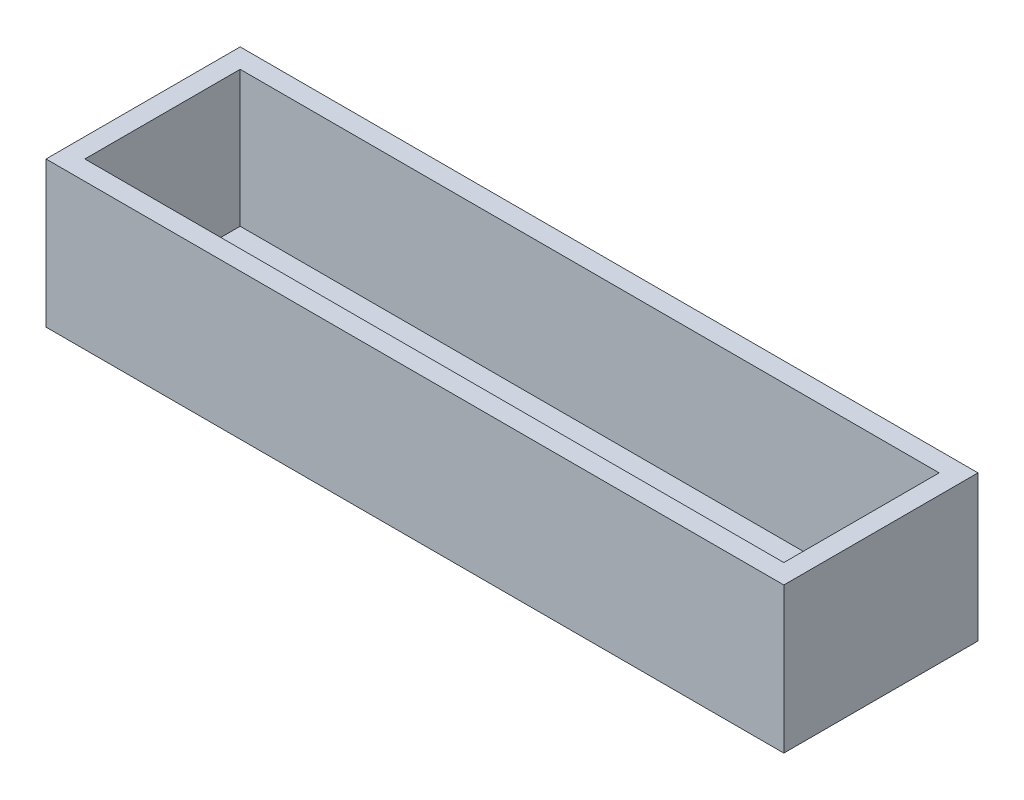
ISO-10303-21;
HEADER;
FILE_DESCRIPTION(('STEP AP214'),'2;1');
FILE_NAME('part.step','',(''),(''),'','','');
FILE_SCHEMA(('AUTOMOTIVE_DESIGN { 1 0 10303 214 1 1 1 1 }'));
ENDSEC;
DATA;
#1=APPLICATION_CONTEXT('core data for automotive mechanical design processes');
#2=APPLICATION_PROTOCOL_DEFINITION('international standard','automotive_design',2000,#1);
#3=PRODUCT_CONTEXT('',#1,'mechanical');
#4=PRODUCT('Part','Part','',(#3));
#5=PRODUCT_RELATED_PRODUCT_CATEGORY('part','',(#4));
#6=PRODUCT_DEFINITION_FORMATION('','',#4);
#7=PRODUCT_DEFINITION_CONTEXT('part definition',#1,'design');
#8=PRODUCT_DEFINITION('design','',#6,#7);
#9=PRODUCT_DEFINITION_SHAPE('','',#8);
#10=(LENGTH_UNIT() NAMED_UNIT(*) SI_UNIT(.MILLI.,.METRE.));
#11=(NAMED_UNIT(*) PLANE_ANGLE_UNIT() SI_UNIT($,.RADIAN.));
#12=(NAMED_UNIT(*) SI_UNIT($,.STERADIAN.) SOLID_ANGLE_UNIT());
#13=UNCERTAINTY_MEASURE_WITH_UNIT(LENGTH_MEASURE(1.E-05),#10,'distance_accuracy_value','');
#14=(GEOMETRIC_REPRESENTATION_CONTEXT(3) GLOBAL_UNCERTAINTY_ASSIGNED_CONTEXT((#13)) GLOBAL_UNIT_ASSIGNED_CONTEXT((#10,
#11,#12)) REPRESENTATION_CONTEXT('',''));
#15=CARTESIAN_POINT('',(0.,0.,0.));
#16=DIRECTION('',(0.,0.,1.));
#17=DIRECTION('',(1.,0.,0.));
#18=AXIS2_PLACEMENT_3D('',#15,#16,#17);
#19=CARTESIAN_POINT('',(38.,15.,-10.));
#20=DIRECTION('',(-1.,0.,0.));
#21=DIRECTION('',(0.,0.,1.));
#22=AXIS2_PLACEMENT_3D('',#19,#20,#21);
#23=PLANE('',#22);
#24=DIRECTION('',(0.,0.,-1.));
#25=VECTOR('',#24,1.);
#26=CARTESIAN_POINT('',(38.,0.,-10.));
#27=LINE('',#26,#25);
#28=CARTESIAN_POINT('',(38.,0.,10.));
#29=VERTEX_POINT('',#28);
#30=CARTESIAN_POINT('',(38.,0.,-10.));
#31=VERTEX_POINT('',#30);
#32=EDGE_CURVE('E158',#29,#31,#27,.T.);
#33=ORIENTED_EDGE('',*,*,#32,.T.);
#34=DIRECTION('',(0.,-1.,0.));
#35=VECTOR('',#34,1.);
#36=CARTESIAN_POINT('',(38.,15.,-10.));
#37=LINE('',#36,#35);
#38=CARTESIAN_POINT('',(38.,15.,-10.));
#39=VERTEX_POINT('',#38);
#40=EDGE_CURVE('E11',#39,#31,#37,.T.);
#41=ORIENTED_EDGE('',*,*,#40,.F.);
#42=DIRECTION('',(0.,0.,-1.));
#43=VECTOR('',#42,1.);
#44=CARTESIAN_POINT('',(38.,15.,-10.));
#45=LINE('',#44,#43);
#46=CARTESIAN_POINT('',(38.,15.,10.));
#47=VERTEX_POINT('',#46);
#48=EDGE_CURVE('E164',#47,#39,#45,.T.);
#49=ORIENTED_EDGE('',*,*,#48,.F.);
#50=DIRECTION('',(0.,-1.,0.));
#51=VECTOR('',#50,1.);
#52=CARTESIAN_POINT('',(38.,15.,10.));
#53=LINE('',#52,#51);
#54=EDGE_CURVE('E174',#47,#29,#53,.T.);
#55=ORIENTED_EDGE('',*,*,#54,.T.);
#56=EDGE_LOOP('',(#33,#41,#49,#55));
#57=FACE_BOUND('',#56,.T.);
#58=ADVANCED_FACE('F39',(#57),#23,.F.);
#59=CARTESIAN_POINT('',(-38.,15.,-10.));
#60=DIRECTION('',(0.,0.,1.));
#61=DIRECTION('',(1.,0.,0.));
#62=AXIS2_PLACEMENT_3D('',#59,#60,#61);
#63=PLANE('',#62);
#64=DIRECTION('',(-1.,0.,0.));
#65=VECTOR('',#64,1.);
#66=CARTESIAN_POINT('',(-38.,0.,-10.));
#67=LINE('',#66,#65);
#68=CARTESIAN_POINT('',(-38.,0.,-10.));
#69=VERTEX_POINT('',#68);
#70=EDGE_CURVE('E178',#31,#69,#67,.T.);
#71=ORIENTED_EDGE('',*,*,#70,.T.);
#72=DIRECTION('',(0.,-1.,0.));
#73=VECTOR('',#72,1.);
#74=CARTESIAN_POINT('',(-38.,15.,-10.));
#75=LINE('',#74,#73);
#76=CARTESIAN_POINT('',(-38.,15.,-10.));
#77=VERTEX_POINT('',#76);
#78=EDGE_CURVE('E47',#77,#69,#75,.T.);
#79=ORIENTED_EDGE('',*,*,#78,.F.);
#80=DIRECTION('',(-1.,0.,0.));
#81=VECTOR('',#80,1.);
#82=CARTESIAN_POINT('',(-38.,15.,-10.));
#83=LINE('',#82,#81);
#84=EDGE_CURVE('E91',#39,#77,#83,.T.);
#85=ORIENTED_EDGE('',*,*,#84,.F.);
#86=ORIENTED_EDGE('',*,*,#40,.T.);
#87=EDGE_LOOP('',(#71,#79,#85,#86));
#88=FACE_BOUND('',#87,.T.);
#89=ADVANCED_FACE('F213',(#88),#63,.F.);
#90=CARTESIAN_POINT('',(-38.,15.,-10.));
#91=DIRECTION('',(1.,0.,0.));
#92=DIRECTION('',(0.,0.,-1.));
#93=AXIS2_PLACEMENT_3D('',#90,#91,#92);
#94=PLANE('',#93);
#95=DIRECTION('',(0.,0.,1.));
#96=VECTOR('',#95,1.);
#97=CARTESIAN_POINT('',(-38.,0.,-10.));
#98=LINE('',#97,#96);
#99=CARTESIAN_POINT('',(-38.,0.,10.));
#100=VERTEX_POINT('',#99);
#101=EDGE_CURVE('E181',#69,#100,#98,.T.);
#102=ORIENTED_EDGE('',*,*,#101,.T.);
#103=DIRECTION('',(0.,-1.,0.));
#104=VECTOR('',#103,1.);
#105=CARTESIAN_POINT('',(-38.,15.,10.));
#106=LINE('',#105,#104);
#107=CARTESIAN_POINT('',(-38.,15.,10.));
#108=VERTEX_POINT('',#107);
#109=EDGE_CURVE('E188',#108,#100,#106,.T.);
#110=ORIENTED_EDGE('',*,*,#109,.F.);
#111=DIRECTION('',(0.,0.,1.));
#112=VECTOR('',#111,1.);
#113=CARTESIAN_POINT('',(-38.,15.,-10.));
#114=LINE('',#113,#112);
#115=EDGE_CURVE('E169',#77,#108,#114,.T.);
#116=ORIENTED_EDGE('',*,*,#115,.F.);
#117=ORIENTED_EDGE('',*,*,#78,.T.);
#118=EDGE_LOOP('',(#102,#110,#116,#117));
#119=FACE_BOUND('',#118,.T.);
#120=ADVANCED_FACE('F195',(#119),#94,.F.);
#121=CARTESIAN_POINT('',(-38.,15.,10.));
#122=DIRECTION('',(0.,0.,-1.));
#123=DIRECTION('',(-1.,0.,0.));
#124=AXIS2_PLACEMENT_3D('',#121,#122,#123);
#125=PLANE('',#124);
#126=DIRECTION('',(1.,0.,0.));
#127=VECTOR('',#126,1.);
#128=CARTESIAN_POINT('',(-38.,0.,10.));
#129=LINE('',#128,#127);
#130=EDGE_CURVE('E84',#100,#29,#129,.T.);
#131=ORIENTED_EDGE('',*,*,#130,.T.);
#132=ORIENTED_EDGE('',*,*,#54,.F.);
#133=DIRECTION('',(1.,0.,0.));
#134=VECTOR('',#133,1.);
#135=CARTESIAN_POINT('',(-38.,15.,10.));
#136=LINE('',#135,#134);
#137=EDGE_CURVE('E63',#108,#47,#136,.T.);
#138=ORIENTED_EDGE('',*,*,#137,.F.);
#139=ORIENTED_EDGE('',*,*,#109,.T.);
#140=EDGE_LOOP('',(#131,#132,#138,#139));
#141=FACE_BOUND('',#140,.T.);
#142=ADVANCED_FACE('F203',(#141),#125,.F.);
#143=CARTESIAN_POINT('',(0.,15.,0.));
#144=DIRECTION('',(0.,1.,0.));
#145=DIRECTION('',(0.,0.,1.));
#146=AXIS2_PLACEMENT_3D('',#143,#144,#145);
#147=PLANE('',#146);
#148=DIRECTION('',(0.,0.,-1.));
#149=VECTOR('',#148,1.);
#150=CARTESIAN_POINT('',(36.,15.,-8.));
#151=LINE('',#150,#149);
#152=CARTESIAN_POINT('',(36.,15.,8.));
#153=VERTEX_POINT('',#152);
#154=CARTESIAN_POINT('',(36.,15.,-8.));
#155=VERTEX_POINT('',#154);
#156=EDGE_CURVE('E54',#153,#155,#151,.T.);
#157=ORIENTED_EDGE('',*,*,#156,.F.);
#158=DIRECTION('',(1.,0.,0.));
#159=VECTOR('',#158,1.);
#160=CARTESIAN_POINT('',(-36.,15.,8.));
#161=LINE('',#160,#159);
#162=CARTESIAN_POINT('',(-36.,15.,8.));
#163=VERTEX_POINT('',#162);
#164=EDGE_CURVE('E136',#163,#153,#161,.T.);
#165=ORIENTED_EDGE('',*,*,#164,.F.);
#166=DIRECTION('',(0.,0.,1.));
#167=VECTOR('',#166,1.);
#168=CARTESIAN_POINT('',(-36.,15.,-8.));
#169=LINE('',#168,#167);
#170=CARTESIAN_POINT('',(-36.,15.,-8.));
#171=VERTEX_POINT('',#170);
#172=EDGE_CURVE('E140',#171,#163,#169,.T.);
#173=ORIENTED_EDGE('',*,*,#172,.F.);
#174=DIRECTION('',(-1.,0.,0.));
#175=VECTOR('',#174,1.);
#176=CARTESIAN_POINT('',(-36.,15.,-8.));
#177=LINE('',#176,#175);
#178=EDGE_CURVE('E149',#155,#171,#177,.T.);
#179=ORIENTED_EDGE('',*,*,#178,.F.);
#180=EDGE_LOOP('',(#157,#165,#173,#179));
#181=FACE_BOUND('',#180,.T.);
#182=ORIENTED_EDGE('',*,*,#48,.T.);
#183=ORIENTED_EDGE('',*,*,#84,.T.);
#184=ORIENTED_EDGE('',*,*,#115,.T.);
#185=ORIENTED_EDGE('',*,*,#137,.T.);
#186=EDGE_LOOP('',(#182,#183,#184,#185));
#187=FACE_BOUND('',#186,.T.);
#188=ADVANCED_FACE('F205',(#181,#187),#147,.T.);
#189=CARTESIAN_POINT('',(0.,0.,0.));
#190=DIRECTION('',(0.,1.,0.));
#191=DIRECTION('',(0.,0.,1.));
#192=AXIS2_PLACEMENT_3D('',#189,#190,#191);
#193=PLANE('',#192);
#194=ORIENTED_EDGE('',*,*,#32,.F.);
#195=ORIENTED_EDGE('',*,*,#130,.F.);
#196=ORIENTED_EDGE('',*,*,#101,.F.);
#197=ORIENTED_EDGE('',*,*,#70,.F.);
#198=EDGE_LOOP('',(#194,#195,#196,#197));
#199=FACE_BOUND('',#198,.T.);
#200=ADVANCED_FACE('F199',(#199),#193,.F.);
#201=CARTESIAN_POINT('',(36.,0.999999999999999,-8.));
#202=DIRECTION('',(1.,0.,0.));
#203=DIRECTION('',(0.,0.,-1.));
#204=AXIS2_PLACEMENT_3D('',#201,#202,#203);
#205=PLANE('',#204);
#206=ORIENTED_EDGE('',*,*,#156,.T.);
#207=DIRECTION('',(0.,1.,0.));
#208=VECTOR('',#207,1.);
#209=CARTESIAN_POINT('',(36.,0.999999999999999,-8.));
#210=LINE('',#209,#208);
#211=CARTESIAN_POINT('',(36.,0.999999999999999,-8.));
#212=VERTEX_POINT('',#211);
#213=EDGE_CURVE('E111',#212,#155,#210,.T.);
#214=ORIENTED_EDGE('',*,*,#213,.F.);
#215=DIRECTION('',(0.,0.,-1.));
#216=VECTOR('',#215,1.);
#217=CARTESIAN_POINT('',(36.,0.999999999999999,-8.));
#218=LINE('',#217,#216);
#219=CARTESIAN_POINT('',(36.,0.999999999999999,8.));
#220=VERTEX_POINT('',#219);
#221=EDGE_CURVE('E115',#220,#212,#218,.T.);
#222=ORIENTED_EDGE('',*,*,#221,.F.);
#223=DIRECTION('',(0.,1.,0.));
#224=VECTOR('',#223,1.);
#225=CARTESIAN_POINT('',(36.,0.999999999999999,8.));
#226=LINE('',#225,#224);
#227=EDGE_CURVE('E155',#220,#153,#226,.T.);
#228=ORIENTED_EDGE('',*,*,#227,.T.);
#229=EDGE_LOOP('',(#206,#214,#222,#228));
#230=FACE_BOUND('',#229,.T.);
#231=ADVANCED_FACE('F113',(#230),#205,.F.);
#232=CARTESIAN_POINT('',(-36.,0.999999999999999,8.));
#233=DIRECTION('',(0.,0.,1.));
#234=DIRECTION('',(1.,0.,0.));
#235=AXIS2_PLACEMENT_3D('',#232,#233,#234);
#236=PLANE('',#235);
#237=ORIENTED_EDGE('',*,*,#164,.T.);
#238=ORIENTED_EDGE('',*,*,#227,.F.);
#239=DIRECTION('',(1.,0.,0.));
#240=VECTOR('',#239,1.);
#241=CARTESIAN_POINT('',(-36.,0.999999999999999,8.));
#242=LINE('',#241,#240);
#243=CARTESIAN_POINT('',(-36.,0.999999999999999,8.));
#244=VERTEX_POINT('',#243);
#245=EDGE_CURVE('E122',#244,#220,#242,.T.);
#246=ORIENTED_EDGE('',*,*,#245,.F.);
#247=DIRECTION('',(0.,1.,0.));
#248=VECTOR('',#247,1.);
#249=CARTESIAN_POINT('',(-36.,0.999999999999999,8.));
#250=LINE('',#249,#248);
#251=EDGE_CURVE('E159',#244,#163,#250,.T.);
#252=ORIENTED_EDGE('',*,*,#251,.T.);
#253=EDGE_LOOP('',(#237,#238,#246,#252));
#254=FACE_BOUND('',#253,.T.);
#255=ADVANCED_FACE('F252',(#254),#236,.F.);
#256=CARTESIAN_POINT('',(-36.,0.999999999999999,-8.));
#257=DIRECTION('',(-1.,0.,0.));
#258=DIRECTION('',(0.,0.,1.));
#259=AXIS2_PLACEMENT_3D('',#256,#257,#258);
#260=PLANE('',#259);
#261=ORIENTED_EDGE('',*,*,#172,.T.);
#262=ORIENTED_EDGE('',*,*,#251,.F.);
#263=DIRECTION('',(0.,0.,1.));
#264=VECTOR('',#263,1.);
#265=CARTESIAN_POINT('',(-36.,0.999999999999999,-8.));
#266=LINE('',#265,#264);
#267=CARTESIAN_POINT('',(-36.,0.999999999999999,-8.));
#268=VERTEX_POINT('',#267);
#269=EDGE_CURVE('E131',#268,#244,#266,.T.);
#270=ORIENTED_EDGE('',*,*,#269,.F.);
#271=DIRECTION('',(0.,1.,0.));
#272=VECTOR('',#271,1.);
#273=CARTESIAN_POINT('',(-36.,0.999999999999999,-8.));
#274=LINE('',#273,#272);
#275=EDGE_CURVE('E121',#268,#171,#274,.T.);
#276=ORIENTED_EDGE('',*,*,#275,.T.);
#277=EDGE_LOOP('',(#261,#262,#270,#276));
#278=FACE_BOUND('',#277,.T.);
#279=ADVANCED_FACE('F261',(#278),#260,.F.);
#280=CARTESIAN_POINT('',(-36.,0.999999999999999,-8.));
#281=DIRECTION('',(0.,0.,-1.));
#282=DIRECTION('',(-1.,0.,0.));
#283=AXIS2_PLACEMENT_3D('',#280,#281,#282);
#284=PLANE('',#283);
#285=ORIENTED_EDGE('',*,*,#178,.T.);
#286=ORIENTED_EDGE('',*,*,#275,.F.);
#287=DIRECTION('',(-1.,0.,0.));
#288=VECTOR('',#287,1.);
#289=CARTESIAN_POINT('',(-36.,0.999999999999999,-8.));
#290=LINE('',#289,#288);
#291=EDGE_CURVE('E125',#212,#268,#290,.T.);
#292=ORIENTED_EDGE('',*,*,#291,.F.);
#293=ORIENTED_EDGE('',*,*,#213,.T.);
#294=EDGE_LOOP('',(#285,#286,#292,#293));
#295=FACE_BOUND('',#294,.T.);
#296=ADVANCED_FACE('F126',(#295),#284,.F.);
#297=CARTESIAN_POINT('',(0.,0.999999999999999,0.));
#298=DIRECTION('',(0.,1.,0.));
#299=DIRECTION('',(0.,0.,1.));
#300=AXIS2_PLACEMENT_3D('',#297,#298,#299);
#301=PLANE('',#300);
#302=ORIENTED_EDGE('',*,*,#221,.T.);
#303=ORIENTED_EDGE('',*,*,#291,.T.);
#304=ORIENTED_EDGE('',*,*,#269,.T.);
#305=ORIENTED_EDGE('',*,*,#245,.T.);
#306=EDGE_LOOP('',(#302,#303,#304,#305));
#307=FACE_BOUND('',#306,.T.);
#308=ADVANCED_FACE('F133',(#307),#301,.T.);
#309=CLOSED_SHELL('',(#58,#89,#120,#142,#188,#200,#231,#255,#279,#296,#308));
#310=MANIFOLD_SOLID_BREP('B2',#309);
#311=ADVANCED_BREP_SHAPE_REPRESENTATION('',(#18,#310),#14);
#312=SHAPE_DEFINITION_REPRESENTATION(#9,#311);
ENDSEC;
END-ISO-10303-21;
